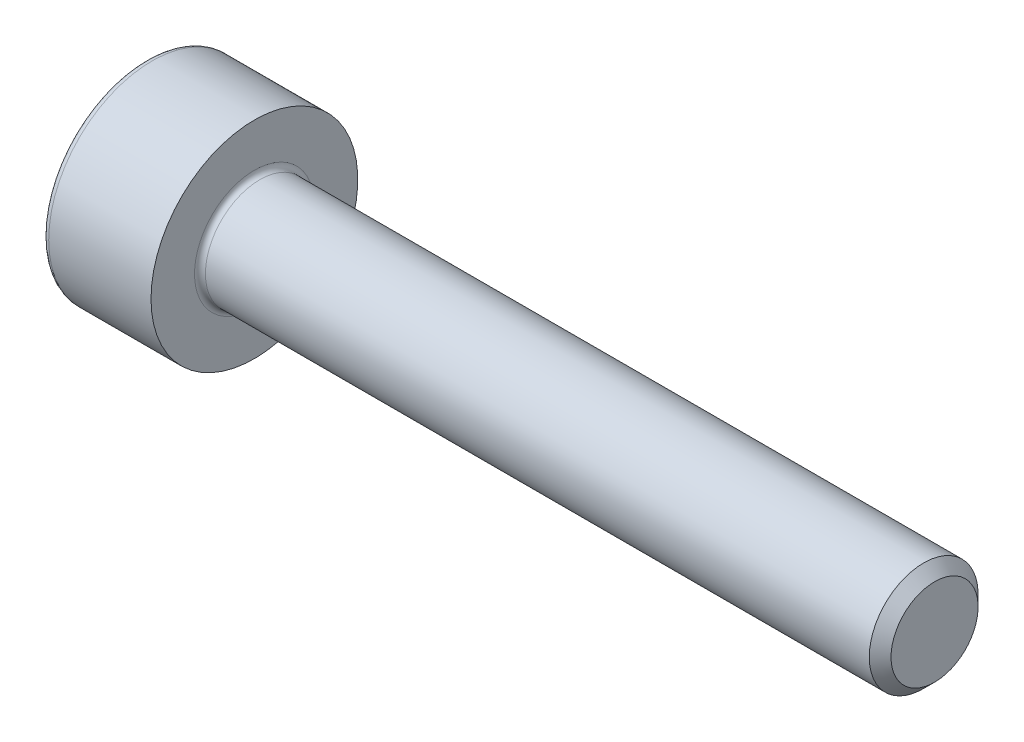
ISO-10303-21;
HEADER;
FILE_DESCRIPTION(('STEP AP214'),'2;1');
FILE_NAME('part.step','',(''),(''),'','','');
FILE_SCHEMA(('AUTOMOTIVE_DESIGN { 1 0 10303 214 1 1 1 1 }'));
ENDSEC;
DATA;
#1=APPLICATION_CONTEXT('core data for automotive mechanical design processes');
#2=APPLICATION_PROTOCOL_DEFINITION('international standard','automotive_design',2000,#1);
#3=PRODUCT_CONTEXT('',#1,'mechanical');
#4=PRODUCT('Part','Part','',(#3));
#5=PRODUCT_RELATED_PRODUCT_CATEGORY('part','',(#4));
#6=PRODUCT_DEFINITION_FORMATION('','',#4);
#7=PRODUCT_DEFINITION_CONTEXT('part definition',#1,'design');
#8=PRODUCT_DEFINITION('design','',#6,#7);
#9=PRODUCT_DEFINITION_SHAPE('','',#8);
#10=(LENGTH_UNIT() NAMED_UNIT(*) SI_UNIT(.MILLI.,.METRE.));
#11=(NAMED_UNIT(*) PLANE_ANGLE_UNIT() SI_UNIT($,.RADIAN.));
#12=(NAMED_UNIT(*) SI_UNIT($,.STERADIAN.) SOLID_ANGLE_UNIT());
#13=UNCERTAINTY_MEASURE_WITH_UNIT(LENGTH_MEASURE(1.E-05),#10,'distance_accuracy_value','');
#14=(GEOMETRIC_REPRESENTATION_CONTEXT(3) GLOBAL_UNCERTAINTY_ASSIGNED_CONTEXT((#13)) GLOBAL_UNIT_ASSIGNED_CONTEXT((#10,
#11,#12)) REPRESENTATION_CONTEXT('',''));
#15=CARTESIAN_POINT('',(0.,0.,0.));
#16=DIRECTION('',(0.,0.,1.));
#17=DIRECTION('',(1.,0.,0.));
#18=AXIS2_PLACEMENT_3D('',#15,#16,#17);
#19=CARTESIAN_POINT('',(14.5000000000048,0.,0.));
#20=DIRECTION('',(-1.,0.,0.));
#21=DIRECTION('',(0.,0.,1.));
#22=AXIS2_PLACEMENT_3D('',#19,#20,#21);
#23=PLANE('',#22);
#24=CARTESIAN_POINT('',(14.5000000000048,0.,0.));
#25=DIRECTION('',(-1.,0.,0.));
#26=DIRECTION('',(0.,0.,1.));
#27=AXIS2_PLACEMENT_3D('',#24,#25,#26);
#28=CIRCLE('',#27,0.800000000000004);
#29=CARTESIAN_POINT('',(14.5000000000048,0.,0.800000000000004));
#30=VERTEX_POINT('',#29);
#31=EDGE_CURVE('E11',#30,#30,#28,.F.);
#32=ORIENTED_EDGE('',*,*,#31,.T.);
#33=EDGE_LOOP('',(#32));
#34=FACE_BOUND('',#33,.T.);
#35=ADVANCED_FACE('F37',(#34),#23,.F.);
#36=CARTESIAN_POINT('',(0.,0.,0.));
#37=DIRECTION('',(-1.,0.,0.));
#38=DIRECTION('',(0.,0.,1.));
#39=AXIS2_PLACEMENT_3D('',#36,#37,#38);
#40=CYLINDRICAL_SURFACE('',#39,1.);
#41=CARTESIAN_POINT('',(14.3000000000048,0.,0.));
#42=DIRECTION('',(-1.,0.,0.));
#43=DIRECTION('',(0.,0.,1.));
#44=AXIS2_PLACEMENT_3D('',#41,#42,#43);
#45=CIRCLE('',#44,1.);
#46=CARTESIAN_POINT('',(14.3000000000048,0.,1.));
#47=VERTEX_POINT('',#46);
#48=EDGE_CURVE('E45',#47,#47,#45,.T.);
#49=ORIENTED_EDGE('',*,*,#48,.T.);
#50=EDGE_LOOP('',(#49));
#51=FACE_BOUND('',#50,.T.);
#52=CARTESIAN_POINT('',(2.10000000000477,0.,0.));
#53=DIRECTION('',(1.,0.,0.));
#54=DIRECTION('',(0.,0.,-1.));
#55=AXIS2_PLACEMENT_3D('',#52,#53,#54);
#56=CIRCLE('',#55,1.);
#57=CARTESIAN_POINT('',(2.10000000000477,0.,-1.));
#58=VERTEX_POINT('',#57);
#59=EDGE_CURVE('E150',#58,#58,#56,.T.);
#60=ORIENTED_EDGE('',*,*,#59,.T.);
#61=EDGE_LOOP('',(#60));
#62=FACE_BOUND('',#61,.T.);
#63=ADVANCED_FACE('F161',(#51,#62),#40,.T.);
#64=CARTESIAN_POINT('',(2.00000000000477,0.,0.));
#65=DIRECTION('',(1.,0.,0.));
#66=DIRECTION('',(0.,0.,-1.));
#67=AXIS2_PLACEMENT_3D('',#64,#65,#66);
#68=PLANE('',#67);
#69=CARTESIAN_POINT('',(2.00000000000477,0.,0.));
#70=DIRECTION('',(1.,0.,0.));
#71=DIRECTION('',(0.,0.,-1.));
#72=AXIS2_PLACEMENT_3D('',#69,#70,#71);
#73=CIRCLE('',#72,1.1);
#74=CARTESIAN_POINT('',(2.00000000000477,0.,-1.1));
#75=VERTEX_POINT('',#74);
#76=EDGE_CURVE('E147',#75,#75,#73,.F.);
#77=ORIENTED_EDGE('',*,*,#76,.T.);
#78=EDGE_LOOP('',(#77));
#79=FACE_BOUND('',#78,.T.);
#80=CARTESIAN_POINT('',(2.00000000000477,0.,0.));
#81=DIRECTION('',(-1.,0.,0.));
#82=DIRECTION('',(0.,0.,1.));
#83=AXIS2_PLACEMENT_3D('',#80,#81,#82);
#84=CIRCLE('',#83,1.9);
#85=CARTESIAN_POINT('',(2.00000000000477,0.,1.9));
#86=VERTEX_POINT('',#85);
#87=EDGE_CURVE('E139',#86,#86,#84,.T.);
#88=ORIENTED_EDGE('',*,*,#87,.F.);
#89=EDGE_LOOP('',(#88));
#90=FACE_BOUND('',#89,.T.);
#91=ADVANCED_FACE('F183',(#79,#90),#68,.T.);
#92=CARTESIAN_POINT('',(0.,0.,0.));
#93=DIRECTION('',(-1.,0.,0.));
#94=DIRECTION('',(0.,0.,1.));
#95=AXIS2_PLACEMENT_3D('',#92,#93,#94);
#96=CYLINDRICAL_SURFACE('',#95,1.9);
#97=CARTESIAN_POINT('',(0.12,0.,0.));
#98=DIRECTION('',(-1.,0.,0.));
#99=DIRECTION('',(0.,0.,1.));
#100=AXIS2_PLACEMENT_3D('',#97,#98,#99);
#101=CIRCLE('',#100,1.9);
#102=CARTESIAN_POINT('',(0.12,0.,1.9));
#103=VERTEX_POINT('',#102);
#104=EDGE_CURVE('E156',#103,#103,#101,.F.);
#105=ORIENTED_EDGE('',*,*,#104,.T.);
#106=EDGE_LOOP('',(#105));
#107=FACE_BOUND('',#106,.T.);
#108=ORIENTED_EDGE('',*,*,#87,.T.);
#109=EDGE_LOOP('',(#108));
#110=FACE_BOUND('',#109,.T.);
#111=ADVANCED_FACE('F193',(#107,#110),#96,.T.);
#112=CARTESIAN_POINT('',(0.,0.,0.));
#113=DIRECTION('',(-1.,0.,0.));
#114=DIRECTION('',(0.,0.,1.));
#115=AXIS2_PLACEMENT_3D('',#112,#113,#114);
#116=PLANE('',#115);
#117=DIRECTION('',(0.,0.5,-0.866025403784439));
#118=VECTOR('',#117,1.);
#119=CARTESIAN_POINT('',(0.,0.43301270189222,0.749999999999999));
#120=LINE('',#119,#118);
#121=CARTESIAN_POINT('',(0.,0.43301270189222,0.749999999999999));
#122=VERTEX_POINT('',#121);
#123=CARTESIAN_POINT('',(0.,0.866025403784438,0.));
#124=VERTEX_POINT('',#123);
#125=EDGE_CURVE('E52',#122,#124,#120,.T.);
#126=ORIENTED_EDGE('',*,*,#125,.F.);
#127=DIRECTION('',(0.,1.,0.));
#128=VECTOR('',#127,1.);
#129=CARTESIAN_POINT('',(0.,-0.43301270189222,0.749999999999999));
#130=LINE('',#129,#128);
#131=CARTESIAN_POINT('',(0.,-0.43301270189222,0.749999999999999));
#132=VERTEX_POINT('',#131);
#133=EDGE_CURVE('E135',#132,#122,#130,.T.);
#134=ORIENTED_EDGE('',*,*,#133,.F.);
#135=DIRECTION('',(0.,0.5,0.866025403784439));
#136=VECTOR('',#135,1.);
#137=CARTESIAN_POINT('',(0.,-0.866025403784438,0.));
#138=LINE('',#137,#136);
#139=CARTESIAN_POINT('',(0.,-0.866025403784438,0.));
#140=VERTEX_POINT('',#139);
#141=EDGE_CURVE('E133',#140,#132,#138,.T.);
#142=ORIENTED_EDGE('',*,*,#141,.F.);
#143=DIRECTION('',(0.,-0.5,0.866025403784439));
#144=VECTOR('',#143,1.);
#145=CARTESIAN_POINT('',(0.,-0.433012701892219,-0.75));
#146=LINE('',#145,#144);
#147=CARTESIAN_POINT('',(0.,-0.433012701892219,-0.75));
#148=VERTEX_POINT('',#147);
#149=EDGE_CURVE('E100',#148,#140,#146,.T.);
#150=ORIENTED_EDGE('',*,*,#149,.F.);
#151=DIRECTION('',(0.,-1.,0.));
#152=VECTOR('',#151,1.);
#153=CARTESIAN_POINT('',(0.,0.433012701892219,-0.75));
#154=LINE('',#153,#152);
#155=CARTESIAN_POINT('',(0.,0.433012701892219,-0.75));
#156=VERTEX_POINT('',#155);
#157=EDGE_CURVE('E129',#156,#148,#154,.T.);
#158=ORIENTED_EDGE('',*,*,#157,.F.);
#159=DIRECTION('',(0.,-0.5,-0.866025403784439));
#160=VECTOR('',#159,1.);
#161=CARTESIAN_POINT('',(0.,0.866025403784438,0.));
#162=LINE('',#161,#160);
#163=EDGE_CURVE('E126',#124,#156,#162,.T.);
#164=ORIENTED_EDGE('',*,*,#163,.F.);
#165=EDGE_LOOP('',(#126,#134,#142,#150,#158,#164));
#166=FACE_BOUND('',#165,.T.);
#167=CARTESIAN_POINT('',(0.,0.,0.));
#168=DIRECTION('',(-1.,0.,0.));
#169=DIRECTION('',(0.,0.,1.));
#170=AXIS2_PLACEMENT_3D('',#167,#168,#169);
#171=CIRCLE('',#170,1.78);
#172=CARTESIAN_POINT('',(0.,0.,1.78));
#173=VERTEX_POINT('',#172);
#174=EDGE_CURVE('E153',#173,#173,#171,.T.);
#175=ORIENTED_EDGE('',*,*,#174,.T.);
#176=EDGE_LOOP('',(#175));
#177=FACE_BOUND('',#176,.T.);
#178=ADVANCED_FACE('F188',(#166,#177),#116,.T.);
#179=CARTESIAN_POINT('',(2.10000000000477,0.,0.));
#180=DIRECTION('',(1.,0.,0.));
#181=DIRECTION('',(0.,0.,-1.));
#182=AXIS2_PLACEMENT_3D('',#179,#180,#181);
#183=TOROIDAL_SURFACE('',#182,1.1,0.1);
#184=ORIENTED_EDGE('',*,*,#59,.F.);
#185=EDGE_LOOP('',(#184));
#186=FACE_BOUND('',#185,.T.);
#187=ORIENTED_EDGE('',*,*,#76,.F.);
#188=EDGE_LOOP('',(#187));
#189=FACE_BOUND('',#188,.T.);
#190=ADVANCED_FACE('F174',(#186,#189),#183,.F.);
#191=CARTESIAN_POINT('',(0.12,0.,0.));
#192=DIRECTION('',(-1.,0.,0.));
#193=DIRECTION('',(0.,0.,1.));
#194=AXIS2_PLACEMENT_3D('',#191,#192,#193);
#195=TOROIDAL_SURFACE('',#194,1.78,0.12);
#196=ORIENTED_EDGE('',*,*,#104,.F.);
#197=EDGE_LOOP('',(#196));
#198=FACE_BOUND('',#197,.T.);
#199=ORIENTED_EDGE('',*,*,#174,.F.);
#200=EDGE_LOOP('',(#199));
#201=FACE_BOUND('',#200,.T.);
#202=ADVANCED_FACE('F166',(#198,#201),#195,.T.);
#203=CARTESIAN_POINT('',(14.3000000000048,0.,0.));
#204=DIRECTION('',(-1.,0.,0.));
#205=DIRECTION('',(0.,0.,1.));
#206=AXIS2_PLACEMENT_3D('',#203,#204,#205);
#207=CONICAL_SURFACE('',#206,1.,0.785398163397445);
#208=ORIENTED_EDGE('',*,*,#31,.F.);
#209=EDGE_LOOP('',(#208));
#210=FACE_BOUND('',#209,.T.);
#211=ORIENTED_EDGE('',*,*,#48,.F.);
#212=EDGE_LOOP('',(#211));
#213=FACE_BOUND('',#212,.T.);
#214=ADVANCED_FACE('F39',(#210,#213),#207,.T.);
#215=CARTESIAN_POINT('',(1.,0.43301270189222,0.749999999999999));
#216=DIRECTION('',(0.,0.866025403784439,0.5));
#217=DIRECTION('',(0.,-0.5,0.866025403784439));
#218=AXIS2_PLACEMENT_3D('',#215,#216,#217);
#219=PLANE('',#218);
#220=ORIENTED_EDGE('',*,*,#125,.T.);
#221=DIRECTION('',(-1.,0.,0.));
#222=VECTOR('',#221,1.);
#223=CARTESIAN_POINT('',(1.,0.866025403784438,0.));
#224=LINE('',#223,#222);
#225=CARTESIAN_POINT('',(1.,0.866025403784438,0.));
#226=VERTEX_POINT('',#225);
#227=EDGE_CURVE('E82',#226,#124,#224,.T.);
#228=ORIENTED_EDGE('',*,*,#227,.F.);
#229=DIRECTION('',(0.,0.5,-0.866025403784439));
#230=VECTOR('',#229,1.);
#231=CARTESIAN_POINT('',(1.,0.43301270189222,0.749999999999999));
#232=LINE('',#231,#230);
#233=CARTESIAN_POINT('',(1.,0.43301270189222,0.749999999999999));
#234=VERTEX_POINT('',#233);
#235=EDGE_CURVE('E137',#234,#226,#232,.T.);
#236=ORIENTED_EDGE('',*,*,#235,.F.);
#237=DIRECTION('',(-1.,0.,0.));
#238=VECTOR('',#237,1.);
#239=CARTESIAN_POINT('',(1.,0.43301270189222,0.749999999999999));
#240=LINE('',#239,#238);
#241=EDGE_CURVE('E60',#234,#122,#240,.T.);
#242=ORIENTED_EDGE('',*,*,#241,.T.);
#243=EDGE_LOOP('',(#220,#228,#236,#242));
#244=FACE_BOUND('',#243,.T.);
#245=ADVANCED_FACE('F165',(#244),#219,.F.);
#246=CARTESIAN_POINT('',(1.,-0.43301270189222,0.749999999999999));
#247=DIRECTION('',(0.,0.,1.));
#248=DIRECTION('',(0.,-1.,0.));
#249=AXIS2_PLACEMENT_3D('',#246,#247,#248);
#250=PLANE('',#249);
#251=ORIENTED_EDGE('',*,*,#133,.T.);
#252=ORIENTED_EDGE('',*,*,#241,.F.);
#253=DIRECTION('',(0.,1.,0.));
#254=VECTOR('',#253,1.);
#255=CARTESIAN_POINT('',(1.,-0.43301270189222,0.749999999999999));
#256=LINE('',#255,#254);
#257=CARTESIAN_POINT('',(1.,-0.43301270189222,0.749999999999999));
#258=VERTEX_POINT('',#257);
#259=EDGE_CURVE('E112',#258,#234,#256,.T.);
#260=ORIENTED_EDGE('',*,*,#259,.F.);
#261=DIRECTION('',(-1.,0.,0.));
#262=VECTOR('',#261,1.);
#263=CARTESIAN_POINT('',(1.,-0.43301270189222,0.749999999999999));
#264=LINE('',#263,#262);
#265=EDGE_CURVE('E104',#258,#132,#264,.T.);
#266=ORIENTED_EDGE('',*,*,#265,.T.);
#267=EDGE_LOOP('',(#251,#252,#260,#266));
#268=FACE_BOUND('',#267,.T.);
#269=ADVANCED_FACE('F172',(#268),#250,.F.);
#270=CARTESIAN_POINT('',(1.,-0.866025403784438,0.));
#271=DIRECTION('',(0.,-0.866025403784439,0.5));
#272=DIRECTION('',(0.,-0.5,-0.866025403784439));
#273=AXIS2_PLACEMENT_3D('',#270,#271,#272);
#274=PLANE('',#273);
#275=ORIENTED_EDGE('',*,*,#141,.T.);
#276=ORIENTED_EDGE('',*,*,#265,.F.);
#277=DIRECTION('',(0.,0.5,0.866025403784439));
#278=VECTOR('',#277,1.);
#279=CARTESIAN_POINT('',(1.,-0.866025403784438,0.));
#280=LINE('',#279,#278);
#281=CARTESIAN_POINT('',(1.,-0.866025403784438,0.));
#282=VERTEX_POINT('',#281);
#283=EDGE_CURVE('E108',#282,#258,#280,.T.);
#284=ORIENTED_EDGE('',*,*,#283,.F.);
#285=DIRECTION('',(-1.,0.,0.));
#286=VECTOR('',#285,1.);
#287=CARTESIAN_POINT('',(1.,-0.866025403784438,0.));
#288=LINE('',#287,#286);
#289=EDGE_CURVE('E93',#282,#140,#288,.T.);
#290=ORIENTED_EDGE('',*,*,#289,.T.);
#291=EDGE_LOOP('',(#275,#276,#284,#290));
#292=FACE_BOUND('',#291,.T.);
#293=ADVANCED_FACE('F109',(#292),#274,.F.);
#294=CARTESIAN_POINT('',(1.,-0.433012701892219,-0.75));
#295=DIRECTION('',(0.,-0.866025403784439,-0.5));
#296=DIRECTION('',(0.,0.5,-0.866025403784439));
#297=AXIS2_PLACEMENT_3D('',#294,#295,#296);
#298=PLANE('',#297);
#299=ORIENTED_EDGE('',*,*,#149,.T.);
#300=ORIENTED_EDGE('',*,*,#289,.F.);
#301=DIRECTION('',(0.,-0.5,0.866025403784439));
#302=VECTOR('',#301,1.);
#303=CARTESIAN_POINT('',(1.,-0.433012701892219,-0.75));
#304=LINE('',#303,#302);
#305=CARTESIAN_POINT('',(1.,-0.433012701892219,-0.75));
#306=VERTEX_POINT('',#305);
#307=EDGE_CURVE('E97',#306,#282,#304,.T.);
#308=ORIENTED_EDGE('',*,*,#307,.F.);
#309=DIRECTION('',(-1.,0.,0.));
#310=VECTOR('',#309,1.);
#311=CARTESIAN_POINT('',(1.,-0.433012701892219,-0.75));
#312=LINE('',#311,#310);
#313=EDGE_CURVE('E105',#306,#148,#312,.T.);
#314=ORIENTED_EDGE('',*,*,#313,.T.);
#315=EDGE_LOOP('',(#299,#300,#308,#314));
#316=FACE_BOUND('',#315,.T.);
#317=ADVANCED_FACE('F95',(#316),#298,.F.);
#318=CARTESIAN_POINT('',(1.,0.433012701892219,-0.75));
#319=DIRECTION('',(0.,0.,-1.));
#320=DIRECTION('',(0.,1.,0.));
#321=AXIS2_PLACEMENT_3D('',#318,#319,#320);
#322=PLANE('',#321);
#323=ORIENTED_EDGE('',*,*,#157,.T.);
#324=ORIENTED_EDGE('',*,*,#313,.F.);
#325=DIRECTION('',(0.,-1.,0.));
#326=VECTOR('',#325,1.);
#327=CARTESIAN_POINT('',(1.,0.433012701892219,-0.75));
#328=LINE('',#327,#326);
#329=CARTESIAN_POINT('',(1.,0.433012701892219,-0.75));
#330=VERTEX_POINT('',#329);
#331=EDGE_CURVE('E118',#330,#306,#328,.T.);
#332=ORIENTED_EDGE('',*,*,#331,.F.);
#333=DIRECTION('',(-1.,0.,0.));
#334=VECTOR('',#333,1.);
#335=CARTESIAN_POINT('',(1.,0.433012701892219,-0.75));
#336=LINE('',#335,#334);
#337=EDGE_CURVE('E142',#330,#156,#336,.T.);
#338=ORIENTED_EDGE('',*,*,#337,.T.);
#339=EDGE_LOOP('',(#323,#324,#332,#338));
#340=FACE_BOUND('',#339,.T.);
#341=ADVANCED_FACE('F213',(#340),#322,.F.);
#342=CARTESIAN_POINT('',(1.,0.866025403784438,0.));
#343=DIRECTION('',(0.,0.866025403784439,-0.5));
#344=DIRECTION('',(0.,0.5,0.866025403784439));
#345=AXIS2_PLACEMENT_3D('',#342,#343,#344);
#346=PLANE('',#345);
#347=ORIENTED_EDGE('',*,*,#163,.T.);
#348=ORIENTED_EDGE('',*,*,#337,.F.);
#349=DIRECTION('',(0.,-0.5,-0.866025403784439));
#350=VECTOR('',#349,1.);
#351=CARTESIAN_POINT('',(1.,0.866025403784438,0.));
#352=LINE('',#351,#350);
#353=EDGE_CURVE('E120',#226,#330,#352,.T.);
#354=ORIENTED_EDGE('',*,*,#353,.F.);
#355=ORIENTED_EDGE('',*,*,#227,.T.);
#356=EDGE_LOOP('',(#347,#348,#354,#355));
#357=FACE_BOUND('',#356,.T.);
#358=ADVANCED_FACE('F210',(#357),#346,.F.);
#359=CARTESIAN_POINT('',(1.,0.,0.));
#360=DIRECTION('',(-1.,0.,0.));
#361=DIRECTION('',(0.,0.,1.));
#362=AXIS2_PLACEMENT_3D('',#359,#360,#361);
#363=PLANE('',#362);
#364=ORIENTED_EDGE('',*,*,#235,.T.);
#365=ORIENTED_EDGE('',*,*,#353,.T.);
#366=ORIENTED_EDGE('',*,*,#331,.T.);
#367=ORIENTED_EDGE('',*,*,#307,.T.);
#368=ORIENTED_EDGE('',*,*,#283,.T.);
#369=ORIENTED_EDGE('',*,*,#259,.T.);
#370=EDGE_LOOP('',(#364,#365,#366,#367,#368,#369));
#371=FACE_BOUND('',#370,.T.);
#372=ADVANCED_FACE('F115',(#371),#363,.T.);
#373=CLOSED_SHELL('',(#35,#63,#91,#111,#178,#190,#202,#214,#245,#269,#293,#317,#341,#358,#372));
#374=MANIFOLD_SOLID_BREP('B2',#373);
#375=ADVANCED_BREP_SHAPE_REPRESENTATION('',(#18,#374),#14);
#376=SHAPE_DEFINITION_REPRESENTATION(#9,#375);
ENDSEC;
END-ISO-10303-21;
